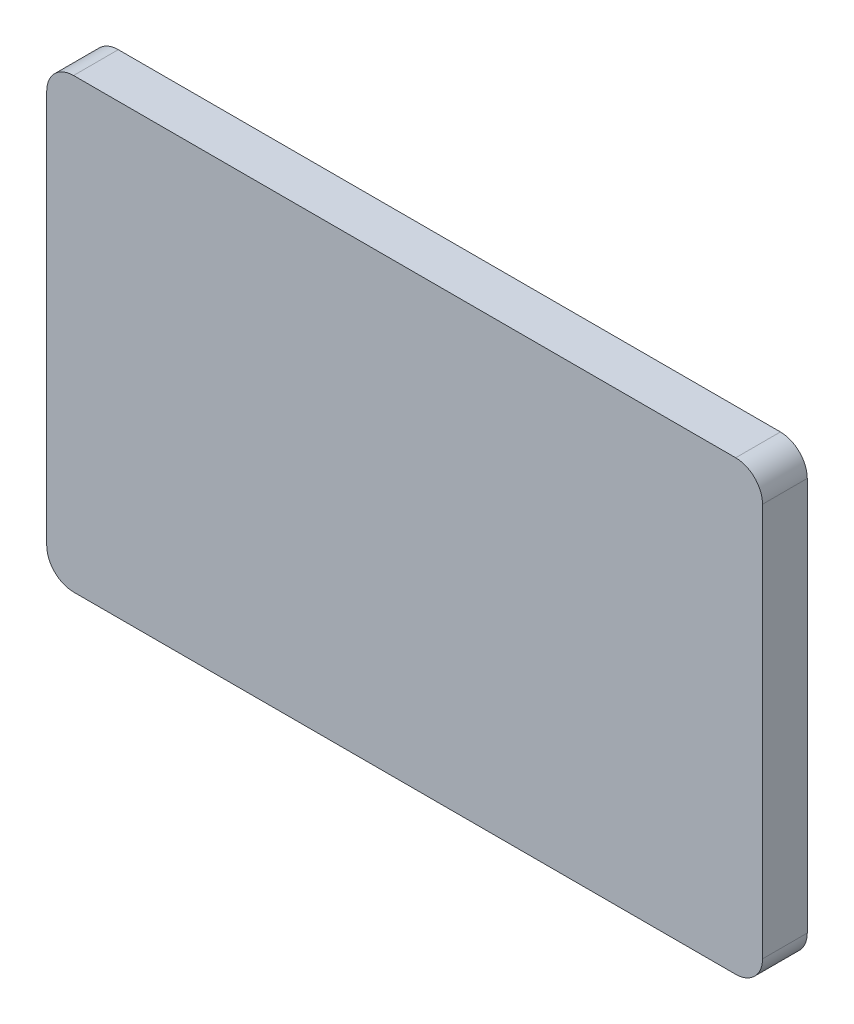
ISO-10303-21;
HEADER;
FILE_DESCRIPTION(('STEP AP214'),'2;1');
FILE_NAME('part.step','',(''),(''),'','','');
FILE_SCHEMA(('AUTOMOTIVE_DESIGN { 1 0 10303 214 1 1 1 1 }'));
ENDSEC;
DATA;
#1=APPLICATION_CONTEXT('core data for automotive mechanical design processes');
#2=APPLICATION_PROTOCOL_DEFINITION('international standard','automotive_design',2000,#1);
#3=PRODUCT_CONTEXT('',#1,'mechanical');
#4=PRODUCT('Part','Part','',(#3));
#5=PRODUCT_RELATED_PRODUCT_CATEGORY('part','',(#4));
#6=PRODUCT_DEFINITION_FORMATION('','',#4);
#7=PRODUCT_DEFINITION_CONTEXT('part definition',#1,'design');
#8=PRODUCT_DEFINITION('design','',#6,#7);
#9=PRODUCT_DEFINITION_SHAPE('','',#8);
#10=(LENGTH_UNIT() NAMED_UNIT(*) SI_UNIT(.MILLI.,.METRE.));
#11=(NAMED_UNIT(*) PLANE_ANGLE_UNIT() SI_UNIT($,.RADIAN.));
#12=(NAMED_UNIT(*) SI_UNIT($,.STERADIAN.) SOLID_ANGLE_UNIT());
#13=UNCERTAINTY_MEASURE_WITH_UNIT(LENGTH_MEASURE(1.E-05),#10,'distance_accuracy_value','');
#14=(GEOMETRIC_REPRESENTATION_CONTEXT(3) GLOBAL_UNCERTAINTY_ASSIGNED_CONTEXT((#13)) GLOBAL_UNIT_ASSIGNED_CONTEXT((#10,
#11,#12)) REPRESENTATION_CONTEXT('',''));
#15=CARTESIAN_POINT('',(0.,0.,0.));
#16=DIRECTION('',(0.,0.,1.));
#17=DIRECTION('',(1.,0.,0.));
#18=AXIS2_PLACEMENT_3D('',#15,#16,#17);
#19=CARTESIAN_POINT('',(40.,25.,5.));
#20=DIRECTION('',(-1.,0.,0.));
#21=DIRECTION('',(0.,0.,1.));
#22=AXIS2_PLACEMENT_3D('',#19,#20,#21);
#23=PLANE('',#22);
#24=DIRECTION('',(0.,1.,0.));
#25=VECTOR('',#24,1.);
#26=CARTESIAN_POINT('',(40.,25.,5.));
#27=LINE('',#26,#25);
#28=CARTESIAN_POINT('',(40.,-22.,5.));
#29=VERTEX_POINT('',#28);
#30=CARTESIAN_POINT('',(40.,22.,5.));
#31=VERTEX_POINT('',#30);
#32=EDGE_CURVE('E130',#29,#31,#27,.T.);
#33=ORIENTED_EDGE('',*,*,#32,.F.);
#34=DIRECTION('',(0.,0.,-1.));
#35=VECTOR('',#34,1.);
#36=CARTESIAN_POINT('',(40.,-22.,5.));
#37=LINE('',#36,#35);
#38=CARTESIAN_POINT('',(40.,-22.,0.));
#39=VERTEX_POINT('',#38);
#40=EDGE_CURVE('E11',#29,#39,#37,.T.);
#41=ORIENTED_EDGE('',*,*,#40,.T.);
#42=DIRECTION('',(0.,1.,0.));
#43=VECTOR('',#42,1.);
#44=CARTESIAN_POINT('',(40.,25.,0.));
#45=LINE('',#44,#43);
#46=CARTESIAN_POINT('',(40.,22.,0.));
#47=VERTEX_POINT('',#46);
#48=EDGE_CURVE('E132',#39,#47,#45,.T.);
#49=ORIENTED_EDGE('',*,*,#48,.T.);
#50=DIRECTION('',(0.,0.,-1.));
#51=VECTOR('',#50,1.);
#52=CARTESIAN_POINT('',(40.,22.,5.));
#53=LINE('',#52,#51);
#54=EDGE_CURVE('E43',#47,#31,#53,.F.);
#55=ORIENTED_EDGE('',*,*,#54,.T.);
#56=EDGE_LOOP('',(#33,#41,#49,#55));
#57=FACE_BOUND('',#56,.T.);
#58=ADVANCED_FACE('F35',(#57),#23,.F.);
#59=CARTESIAN_POINT('',(-40.,25.,5.));
#60=DIRECTION('',(0.,-1.,0.));
#61=DIRECTION('',(0.,0.,-1.));
#62=AXIS2_PLACEMENT_3D('',#59,#60,#61);
#63=PLANE('',#62);
#64=DIRECTION('',(-1.,0.,0.));
#65=VECTOR('',#64,1.);
#66=CARTESIAN_POINT('',(-40.,25.,0.));
#67=LINE('',#66,#65);
#68=CARTESIAN_POINT('',(37.,25.,0.));
#69=VERTEX_POINT('',#68);
#70=CARTESIAN_POINT('',(-37.,25.,0.));
#71=VERTEX_POINT('',#70);
#72=EDGE_CURVE('E128',#69,#71,#67,.T.);
#73=ORIENTED_EDGE('',*,*,#72,.T.);
#74=DIRECTION('',(0.,0.,-1.));
#75=VECTOR('',#74,1.);
#76=CARTESIAN_POINT('',(-37.,25.,5.));
#77=LINE('',#76,#75);
#78=CARTESIAN_POINT('',(-37.,25.,5.));
#79=VERTEX_POINT('',#78);
#80=EDGE_CURVE('E107',#71,#79,#77,.F.);
#81=ORIENTED_EDGE('',*,*,#80,.T.);
#82=DIRECTION('',(-1.,0.,0.));
#83=VECTOR('',#82,1.);
#84=CARTESIAN_POINT('',(-40.,25.,5.));
#85=LINE('',#84,#83);
#86=CARTESIAN_POINT('',(37.,25.,5.));
#87=VERTEX_POINT('',#86);
#88=EDGE_CURVE('E168',#87,#79,#85,.T.);
#89=ORIENTED_EDGE('',*,*,#88,.F.);
#90=DIRECTION('',(0.,0.,-1.));
#91=VECTOR('',#90,1.);
#92=CARTESIAN_POINT('',(37.,25.,5.));
#93=LINE('',#92,#91);
#94=EDGE_CURVE('E112',#87,#69,#93,.T.);
#95=ORIENTED_EDGE('',*,*,#94,.T.);
#96=EDGE_LOOP('',(#73,#81,#89,#95));
#97=FACE_BOUND('',#96,.T.);
#98=ADVANCED_FACE('F172',(#97),#63,.F.);
#99=CARTESIAN_POINT('',(-40.,25.,5.));
#100=DIRECTION('',(1.,0.,0.));
#101=DIRECTION('',(0.,1.,0.));
#102=AXIS2_PLACEMENT_3D('',#99,#100,#101);
#103=PLANE('',#102);
#104=DIRECTION('',(0.,-1.,0.));
#105=VECTOR('',#104,1.);
#106=CARTESIAN_POINT('',(-40.,25.,5.));
#107=LINE('',#106,#105);
#108=CARTESIAN_POINT('',(-40.,22.,5.));
#109=VERTEX_POINT('',#108);
#110=CARTESIAN_POINT('',(-40.,-22.,5.));
#111=VERTEX_POINT('',#110);
#112=EDGE_CURVE('E121',#109,#111,#107,.T.);
#113=ORIENTED_EDGE('',*,*,#112,.F.);
#114=DIRECTION('',(0.,0.,-1.));
#115=VECTOR('',#114,1.);
#116=CARTESIAN_POINT('',(-40.,22.,5.));
#117=LINE('',#116,#115);
#118=CARTESIAN_POINT('',(-40.,22.,0.));
#119=VERTEX_POINT('',#118);
#120=EDGE_CURVE('E106',#109,#119,#117,.T.);
#121=ORIENTED_EDGE('',*,*,#120,.T.);
#122=DIRECTION('',(0.,-1.,0.));
#123=VECTOR('',#122,1.);
#124=CARTESIAN_POINT('',(-40.,25.,0.));
#125=LINE('',#124,#123);
#126=CARTESIAN_POINT('',(-40.,-22.,0.));
#127=VERTEX_POINT('',#126);
#128=EDGE_CURVE('E119',#119,#127,#125,.T.);
#129=ORIENTED_EDGE('',*,*,#128,.T.);
#130=DIRECTION('',(0.,0.,-1.));
#131=VECTOR('',#130,1.);
#132=CARTESIAN_POINT('',(-40.,-22.,5.));
#133=LINE('',#132,#131);
#134=EDGE_CURVE('E123',#127,#111,#133,.F.);
#135=ORIENTED_EDGE('',*,*,#134,.T.);
#136=EDGE_LOOP('',(#113,#121,#129,#135));
#137=FACE_BOUND('',#136,.T.);
#138=ADVANCED_FACE('F118',(#137),#103,.F.);
#139=CARTESIAN_POINT('',(-40.,-25.,5.));
#140=DIRECTION('',(0.,1.,0.));
#141=DIRECTION('',(0.,0.,1.));
#142=AXIS2_PLACEMENT_3D('',#139,#140,#141);
#143=PLANE('',#142);
#144=DIRECTION('',(1.,0.,0.));
#145=VECTOR('',#144,1.);
#146=CARTESIAN_POINT('',(-40.,-25.,5.));
#147=LINE('',#146,#145);
#148=CARTESIAN_POINT('',(-37.,-25.,5.));
#149=VERTEX_POINT('',#148);
#150=CARTESIAN_POINT('',(37.,-25.,5.));
#151=VERTEX_POINT('',#150);
#152=EDGE_CURVE('E136',#149,#151,#147,.T.);
#153=ORIENTED_EDGE('',*,*,#152,.F.);
#154=DIRECTION('',(0.,0.,-1.));
#155=VECTOR('',#154,1.);
#156=CARTESIAN_POINT('',(-37.,-25.,5.));
#157=LINE('',#156,#155);
#158=CARTESIAN_POINT('',(-37.,-25.,0.));
#159=VERTEX_POINT('',#158);
#160=EDGE_CURVE('E153',#149,#159,#157,.T.);
#161=ORIENTED_EDGE('',*,*,#160,.T.);
#162=DIRECTION('',(1.,0.,0.));
#163=VECTOR('',#162,1.);
#164=CARTESIAN_POINT('',(-40.,-25.,0.));
#165=LINE('',#164,#163);
#166=CARTESIAN_POINT('',(37.,-25.,0.));
#167=VERTEX_POINT('',#166);
#168=EDGE_CURVE('E127',#159,#167,#165,.T.);
#169=ORIENTED_EDGE('',*,*,#168,.T.);
#170=DIRECTION('',(0.,0.,-1.));
#171=VECTOR('',#170,1.);
#172=CARTESIAN_POINT('',(37.,-25.,5.));
#173=LINE('',#172,#171);
#174=EDGE_CURVE('E50',#167,#151,#173,.F.);
#175=ORIENTED_EDGE('',*,*,#174,.T.);
#176=EDGE_LOOP('',(#153,#161,#169,#175));
#177=FACE_BOUND('',#176,.T.);
#178=ADVANCED_FACE('F179',(#177),#143,.F.);
#179=CARTESIAN_POINT('',(0.,0.,5.));
#180=DIRECTION('',(0.,0.,1.));
#181=DIRECTION('',(1.,0.,0.));
#182=AXIS2_PLACEMENT_3D('',#179,#180,#181);
#183=PLANE('',#182);
#184=ORIENTED_EDGE('',*,*,#88,.T.);
#185=CARTESIAN_POINT('',(-37.,22.,5.));
#186=DIRECTION('',(0.,0.,1.));
#187=DIRECTION('',(1.,0.,0.));
#188=AXIS2_PLACEMENT_3D('',#185,#186,#187);
#189=CIRCLE('',#188,3.);
#190=EDGE_CURVE('E150',#79,#109,#189,.T.);
#191=ORIENTED_EDGE('',*,*,#190,.T.);
#192=ORIENTED_EDGE('',*,*,#112,.T.);
#193=CARTESIAN_POINT('',(-37.,-22.,5.));
#194=DIRECTION('',(0.,0.,1.));
#195=DIRECTION('',(1.,0.,0.));
#196=AXIS2_PLACEMENT_3D('',#193,#194,#195);
#197=CIRCLE('',#196,3.);
#198=EDGE_CURVE('E57',#111,#149,#197,.T.);
#199=ORIENTED_EDGE('',*,*,#198,.T.);
#200=ORIENTED_EDGE('',*,*,#152,.T.);
#201=CARTESIAN_POINT('',(37.,-22.,5.));
#202=DIRECTION('',(0.,0.,1.));
#203=DIRECTION('',(1.,0.,0.));
#204=AXIS2_PLACEMENT_3D('',#201,#202,#203);
#205=CIRCLE('',#204,3.);
#206=EDGE_CURVE('E147',#151,#29,#205,.T.);
#207=ORIENTED_EDGE('',*,*,#206,.T.);
#208=ORIENTED_EDGE('',*,*,#32,.T.);
#209=CARTESIAN_POINT('',(37.,22.,5.));
#210=DIRECTION('',(0.,0.,1.));
#211=DIRECTION('',(1.,0.,0.));
#212=AXIS2_PLACEMENT_3D('',#209,#210,#211);
#213=CIRCLE('',#212,3.);
#214=EDGE_CURVE('E145',#31,#87,#213,.T.);
#215=ORIENTED_EDGE('',*,*,#214,.T.);
#216=EDGE_LOOP('',(#184,#191,#192,#199,#200,#207,#208,#215));
#217=FACE_BOUND('',#216,.T.);
#218=ADVANCED_FACE('F165',(#217),#183,.T.);
#219=CARTESIAN_POINT('',(0.,0.,0.));
#220=DIRECTION('',(0.,0.,1.));
#221=DIRECTION('',(1.,0.,0.));
#222=AXIS2_PLACEMENT_3D('',#219,#220,#221);
#223=PLANE('',#222);
#224=ORIENTED_EDGE('',*,*,#128,.F.);
#225=CARTESIAN_POINT('',(-37.,22.,0.));
#226=DIRECTION('',(0.,0.,1.));
#227=DIRECTION('',(1.,0.,0.));
#228=AXIS2_PLACEMENT_3D('',#225,#226,#227);
#229=CIRCLE('',#228,3.);
#230=EDGE_CURVE('E102',#119,#71,#229,.F.);
#231=ORIENTED_EDGE('',*,*,#230,.T.);
#232=ORIENTED_EDGE('',*,*,#72,.F.);
#233=CARTESIAN_POINT('',(37.,22.,0.));
#234=DIRECTION('',(0.,0.,1.));
#235=DIRECTION('',(1.,0.,0.));
#236=AXIS2_PLACEMENT_3D('',#233,#234,#235);
#237=CIRCLE('',#236,3.);
#238=EDGE_CURVE('E122',#69,#47,#237,.F.);
#239=ORIENTED_EDGE('',*,*,#238,.T.);
#240=ORIENTED_EDGE('',*,*,#48,.F.);
#241=CARTESIAN_POINT('',(37.,-22.,0.));
#242=DIRECTION('',(0.,0.,1.));
#243=DIRECTION('',(1.,0.,0.));
#244=AXIS2_PLACEMENT_3D('',#241,#242,#243);
#245=CIRCLE('',#244,3.);
#246=EDGE_CURVE('E139',#39,#167,#245,.F.);
#247=ORIENTED_EDGE('',*,*,#246,.T.);
#248=ORIENTED_EDGE('',*,*,#168,.F.);
#249=CARTESIAN_POINT('',(-37.,-22.,0.));
#250=DIRECTION('',(0.,0.,1.));
#251=DIRECTION('',(1.,0.,0.));
#252=AXIS2_PLACEMENT_3D('',#249,#250,#251);
#253=CIRCLE('',#252,3.);
#254=EDGE_CURVE('E113',#159,#127,#253,.F.);
#255=ORIENTED_EDGE('',*,*,#254,.T.);
#256=EDGE_LOOP('',(#224,#231,#232,#239,#240,#247,#248,#255));
#257=FACE_BOUND('',#256,.T.);
#258=ADVANCED_FACE('F125',(#257),#223,.F.);
#259=CARTESIAN_POINT('',(-37.,22.,5.));
#260=DIRECTION('',(0.,0.,-1.));
#261=DIRECTION('',(-1.,0.,0.));
#262=AXIS2_PLACEMENT_3D('',#259,#260,#261);
#263=CYLINDRICAL_SURFACE('',#262,3.);
#264=ORIENTED_EDGE('',*,*,#190,.F.);
#265=ORIENTED_EDGE('',*,*,#80,.F.);
#266=ORIENTED_EDGE('',*,*,#230,.F.);
#267=ORIENTED_EDGE('',*,*,#120,.F.);
#268=EDGE_LOOP('',(#264,#265,#266,#267));
#269=FACE_BOUND('',#268,.T.);
#270=ADVANCED_FACE('F105',(#269),#263,.T.);
#271=CARTESIAN_POINT('',(-37.,-22.,5.));
#272=DIRECTION('',(0.,0.,-1.));
#273=DIRECTION('',(-1.,0.,0.));
#274=AXIS2_PLACEMENT_3D('',#271,#272,#273);
#275=CYLINDRICAL_SURFACE('',#274,3.);
#276=ORIENTED_EDGE('',*,*,#198,.F.);
#277=ORIENTED_EDGE('',*,*,#134,.F.);
#278=ORIENTED_EDGE('',*,*,#254,.F.);
#279=ORIENTED_EDGE('',*,*,#160,.F.);
#280=EDGE_LOOP('',(#276,#277,#278,#279));
#281=FACE_BOUND('',#280,.T.);
#282=ADVANCED_FACE('F178',(#281),#275,.T.);
#283=CARTESIAN_POINT('',(37.,-22.,5.));
#284=DIRECTION('',(0.,0.,-1.));
#285=DIRECTION('',(-1.,0.,0.));
#286=AXIS2_PLACEMENT_3D('',#283,#284,#285);
#287=CYLINDRICAL_SURFACE('',#286,3.);
#288=ORIENTED_EDGE('',*,*,#206,.F.);
#289=ORIENTED_EDGE('',*,*,#174,.F.);
#290=ORIENTED_EDGE('',*,*,#246,.F.);
#291=ORIENTED_EDGE('',*,*,#40,.F.);
#292=EDGE_LOOP('',(#288,#289,#290,#291));
#293=FACE_BOUND('',#292,.T.);
#294=ADVANCED_FACE('F181',(#293),#287,.T.);
#295=CARTESIAN_POINT('',(37.,22.,5.));
#296=DIRECTION('',(0.,0.,-1.));
#297=DIRECTION('',(-1.,0.,0.));
#298=AXIS2_PLACEMENT_3D('',#295,#296,#297);
#299=CYLINDRICAL_SURFACE('',#298,3.);
#300=ORIENTED_EDGE('',*,*,#214,.F.);
#301=ORIENTED_EDGE('',*,*,#54,.F.);
#302=ORIENTED_EDGE('',*,*,#238,.F.);
#303=ORIENTED_EDGE('',*,*,#94,.F.);
#304=EDGE_LOOP('',(#300,#301,#302,#303));
#305=FACE_BOUND('',#304,.T.);
#306=ADVANCED_FACE('F37',(#305),#299,.T.);
#307=CLOSED_SHELL('',(#58,#98,#138,#178,#218,#258,#270,#282,#294,#306));
#308=MANIFOLD_SOLID_BREP('B2',#307);
#309=ADVANCED_BREP_SHAPE_REPRESENTATION('',(#18,#308),#14);
#310=SHAPE_DEFINITION_REPRESENTATION(#9,#309);
ENDSEC;
END-ISO-10303-21;
